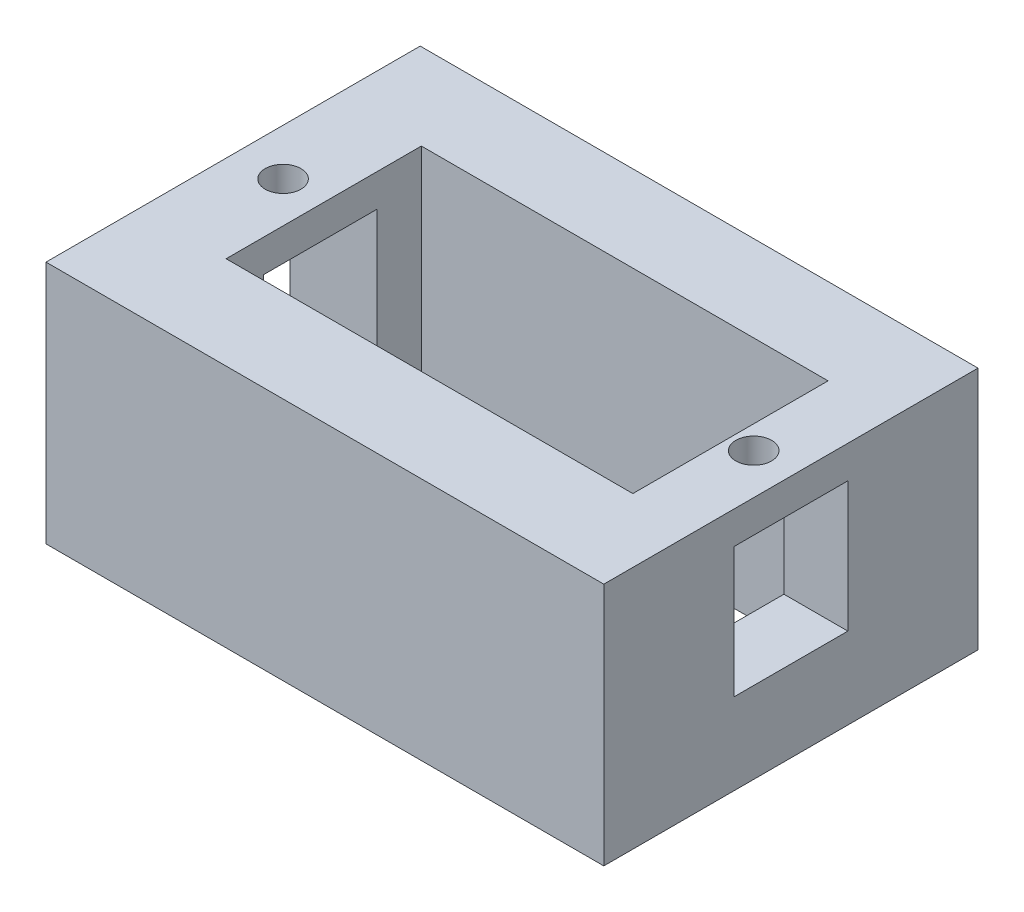
ISO-10303-21;
HEADER;
FILE_DESCRIPTION(('STEP AP214'),'2;1');
FILE_NAME('part.step','',(''),(''),'','','');
FILE_SCHEMA(('AUTOMOTIVE_DESIGN { 1 0 10303 214 1 1 1 1 }'));
ENDSEC;
DATA;
#1=APPLICATION_CONTEXT('core data for automotive mechanical design processes');
#2=APPLICATION_PROTOCOL_DEFINITION('international standard','automotive_design',2000,#1);
#3=PRODUCT_CONTEXT('',#1,'mechanical');
#4=PRODUCT('Part','Part','',(#3));
#5=PRODUCT_RELATED_PRODUCT_CATEGORY('part','',(#4));
#6=PRODUCT_DEFINITION_FORMATION('','',#4);
#7=PRODUCT_DEFINITION_CONTEXT('part definition',#1,'design');
#8=PRODUCT_DEFINITION('design','',#6,#7);
#9=PRODUCT_DEFINITION_SHAPE('','',#8);
#10=(LENGTH_UNIT() NAMED_UNIT(*) SI_UNIT(.MILLI.,.METRE.));
#11=(NAMED_UNIT(*) PLANE_ANGLE_UNIT() SI_UNIT($,.RADIAN.));
#12=(NAMED_UNIT(*) SI_UNIT($,.STERADIAN.) SOLID_ANGLE_UNIT());
#13=UNCERTAINTY_MEASURE_WITH_UNIT(LENGTH_MEASURE(1.E-05),#10,'distance_accuracy_value','');
#14=(GEOMETRIC_REPRESENTATION_CONTEXT(3) GLOBAL_UNCERTAINTY_ASSIGNED_CONTEXT((#13)) GLOBAL_UNIT_ASSIGNED_CONTEXT((#10,
#11,#12)) REPRESENTATION_CONTEXT('',''));
#15=CARTESIAN_POINT('',(0.,0.,0.));
#16=DIRECTION('',(0.,0.,1.));
#17=DIRECTION('',(1.,0.,0.));
#18=AXIS2_PLACEMENT_3D('',#15,#16,#17);
#19=CARTESIAN_POINT('',(-11.7142857142857,15.,-12.5357142857143));
#20=DIRECTION('',(1.,0.,0.));
#21=DIRECTION('',(0.,0.,-1.));
#22=AXIS2_PLACEMENT_3D('',#19,#20,#21);
#23=PLANE('',#22);
#24=DIRECTION('',(0.,0.,1.));
#25=VECTOR('',#24,1.);
#26=CARTESIAN_POINT('',(-11.7142857142857,0.,-12.5357142857143));
#27=LINE('',#26,#25);
#28=CARTESIAN_POINT('',(-11.7142857142857,0.,-12.5357142857143));
#29=VERTEX_POINT('',#28);
#30=CARTESIAN_POINT('',(-11.7142857142857,0.,10.4642857142857));
#31=VERTEX_POINT('',#30);
#32=EDGE_CURVE('E228',#29,#31,#27,.T.);
#33=ORIENTED_EDGE('',*,*,#32,.T.);
#34=DIRECTION('',(0.,-1.,0.));
#35=VECTOR('',#34,1.);
#36=CARTESIAN_POINT('',(-11.7142857142857,15.,10.4642857142857));
#37=LINE('',#36,#35);
#38=CARTESIAN_POINT('',(-11.7142857142857,15.,10.4642857142857));
#39=VERTEX_POINT('',#38);
#40=EDGE_CURVE('E255',#39,#31,#37,.T.);
#41=ORIENTED_EDGE('',*,*,#40,.F.);
#42=DIRECTION('',(0.,0.,1.));
#43=VECTOR('',#42,1.);
#44=CARTESIAN_POINT('',(-11.7142857142857,15.,-12.5357142857143));
#45=LINE('',#44,#43);
#46=CARTESIAN_POINT('',(-11.7142857142857,15.,-12.5357142857143));
#47=VERTEX_POINT('',#46);
#48=EDGE_CURVE('E229',#47,#39,#45,.T.);
#49=ORIENTED_EDGE('',*,*,#48,.F.);
#50=DIRECTION('',(0.,-1.,0.));
#51=VECTOR('',#50,1.);
#52=CARTESIAN_POINT('',(-11.7142857142857,15.,-12.5357142857143));
#53=LINE('',#52,#51);
#54=EDGE_CURVE('E239',#47,#29,#53,.T.);
#55=ORIENTED_EDGE('',*,*,#54,.T.);
#56=EDGE_LOOP('',(#33,#41,#49,#55));
#57=FACE_BOUND('',#56,.T.);
#58=DIRECTION('',(0.,1.,0.));
#59=VECTOR('',#58,1.);
#60=CARTESIAN_POINT('',(-11.7142857142857,0.,-4.53571428571429));
#61=LINE('',#60,#59);
#62=CARTESIAN_POINT('',(-11.7142857142857,5.,-4.53571428571429));
#63=VERTEX_POINT('',#62);
#64=CARTESIAN_POINT('',(-11.7142857142857,13.,-4.53571428571429));
#65=VERTEX_POINT('',#64);
#66=EDGE_CURVE('E49',#63,#65,#61,.T.);
#67=ORIENTED_EDGE('',*,*,#66,.T.);
#68=DIRECTION('',(0.,0.,-1.));
#69=VECTOR('',#68,1.);
#70=CARTESIAN_POINT('',(-11.7142857142857,13.,0.));
#71=LINE('',#70,#69);
#72=CARTESIAN_POINT('',(-11.7142857142857,13.,2.46428571428571));
#73=VERTEX_POINT('',#72);
#74=EDGE_CURVE('E168',#73,#65,#71,.T.);
#75=ORIENTED_EDGE('',*,*,#74,.F.);
#76=DIRECTION('',(0.,-1.,0.));
#77=VECTOR('',#76,1.);
#78=CARTESIAN_POINT('',(-11.7142857142857,0.,2.46428571428571));
#79=LINE('',#78,#77);
#80=CARTESIAN_POINT('',(-11.7142857142857,5.,2.46428571428571));
#81=VERTEX_POINT('',#80);
#82=EDGE_CURVE('E153',#73,#81,#79,.T.);
#83=ORIENTED_EDGE('',*,*,#82,.T.);
#84=DIRECTION('',(0.,0.,-1.));
#85=VECTOR('',#84,1.);
#86=CARTESIAN_POINT('',(-11.7142857142857,5.,0.));
#87=LINE('',#86,#85);
#88=EDGE_CURVE('E162',#81,#63,#87,.T.);
#89=ORIENTED_EDGE('',*,*,#88,.T.);
#90=EDGE_LOOP('',(#67,#75,#83,#89));
#91=FACE_BOUND('',#90,.T.);
#92=ADVANCED_FACE('F34',(#57,#91),#23,.F.);
#93=CARTESIAN_POINT('',(22.5714285714286,15.,-12.5357142857143));
#94=DIRECTION('',(-1.,0.,0.));
#95=DIRECTION('',(0.,0.,1.));
#96=AXIS2_PLACEMENT_3D('',#93,#94,#95);
#97=PLANE('',#96);
#98=DIRECTION('',(0.,0.,-1.));
#99=VECTOR('',#98,1.);
#100=CARTESIAN_POINT('',(22.5714285714286,0.,-12.5357142857143));
#101=LINE('',#100,#99);
#102=CARTESIAN_POINT('',(22.5714285714286,0.,10.4642857142857));
#103=VERTEX_POINT('',#102);
#104=CARTESIAN_POINT('',(22.5714285714286,0.,-12.5357142857143));
#105=VERTEX_POINT('',#104);
#106=EDGE_CURVE('E244',#103,#105,#101,.T.);
#107=ORIENTED_EDGE('',*,*,#106,.T.);
#108=DIRECTION('',(0.,-1.,0.));
#109=VECTOR('',#108,1.);
#110=CARTESIAN_POINT('',(22.5714285714286,15.,-12.5357142857143));
#111=LINE('',#110,#109);
#112=CARTESIAN_POINT('',(22.5714285714286,15.,-12.5357142857143));
#113=VERTEX_POINT('',#112);
#114=EDGE_CURVE('E249',#113,#105,#111,.T.);
#115=ORIENTED_EDGE('',*,*,#114,.F.);
#116=DIRECTION('',(0.,0.,-1.));
#117=VECTOR('',#116,1.);
#118=CARTESIAN_POINT('',(22.5714285714286,15.,-12.5357142857143));
#119=LINE('',#118,#117);
#120=CARTESIAN_POINT('',(22.5714285714286,15.,10.4642857142857));
#121=VERTEX_POINT('',#120);
#122=EDGE_CURVE('E235',#121,#113,#119,.T.);
#123=ORIENTED_EDGE('',*,*,#122,.F.);
#124=DIRECTION('',(0.,-1.,0.));
#125=VECTOR('',#124,1.);
#126=CARTESIAN_POINT('',(22.5714285714286,15.,10.4642857142857));
#127=LINE('',#126,#125);
#128=EDGE_CURVE('E252',#121,#103,#127,.T.);
#129=ORIENTED_EDGE('',*,*,#128,.T.);
#130=EDGE_LOOP('',(#107,#115,#123,#129));
#131=FACE_BOUND('',#130,.T.);
#132=DIRECTION('',(0.,1.,0.));
#133=VECTOR('',#132,1.);
#134=CARTESIAN_POINT('',(22.5714285714286,15.,-4.53571428571429));
#135=LINE('',#134,#133);
#136=CARTESIAN_POINT('',(22.5714285714286,5.,-4.53571428571429));
#137=VERTEX_POINT('',#136);
#138=CARTESIAN_POINT('',(22.5714285714286,13.,-4.53571428571429));
#139=VERTEX_POINT('',#138);
#140=EDGE_CURVE('E195',#137,#139,#135,.T.);
#141=ORIENTED_EDGE('',*,*,#140,.F.);
#142=DIRECTION('',(0.,0.,-1.));
#143=VECTOR('',#142,1.);
#144=CARTESIAN_POINT('',(22.5714285714286,5.,-12.5357142857143));
#145=LINE('',#144,#143);
#146=CARTESIAN_POINT('',(22.5714285714286,5.,2.46428571428571));
#147=VERTEX_POINT('',#146);
#148=EDGE_CURVE('E182',#147,#137,#145,.T.);
#149=ORIENTED_EDGE('',*,*,#148,.F.);
#150=DIRECTION('',(0.,-1.,0.));
#151=VECTOR('',#150,1.);
#152=CARTESIAN_POINT('',(22.5714285714286,15.,2.46428571428571));
#153=LINE('',#152,#151);
#154=CARTESIAN_POINT('',(22.5714285714286,13.,2.46428571428571));
#155=VERTEX_POINT('',#154);
#156=EDGE_CURVE('E185',#155,#147,#153,.T.);
#157=ORIENTED_EDGE('',*,*,#156,.F.);
#158=DIRECTION('',(0.,0.,-1.));
#159=VECTOR('',#158,1.);
#160=CARTESIAN_POINT('',(22.5714285714286,13.,-12.5357142857143));
#161=LINE('',#160,#159);
#162=EDGE_CURVE('E189',#155,#139,#161,.T.);
#163=ORIENTED_EDGE('',*,*,#162,.T.);
#164=EDGE_LOOP('',(#141,#149,#157,#163));
#165=FACE_BOUND('',#164,.T.);
#166=ADVANCED_FACE('F284',(#131,#165),#97,.F.);
#167=CARTESIAN_POINT('',(-6.35714285714286,15.,-7.25));
#168=DIRECTION('',(1.,0.,0.));
#169=DIRECTION('',(0.,0.,-1.));
#170=AXIS2_PLACEMENT_3D('',#167,#168,#169);
#171=PLANE('',#170);
#172=DIRECTION('',(0.,0.,1.));
#173=VECTOR('',#172,1.);
#174=CARTESIAN_POINT('',(-6.35714285714286,0.,-7.25));
#175=LINE('',#174,#173);
#176=CARTESIAN_POINT('',(-6.35714285714286,0.,-7.25));
#177=VERTEX_POINT('',#176);
#178=CARTESIAN_POINT('',(-6.35714285714286,0.,4.75));
#179=VERTEX_POINT('',#178);
#180=EDGE_CURVE('E197',#177,#179,#175,.T.);
#181=ORIENTED_EDGE('',*,*,#180,.F.);
#182=DIRECTION('',(0.,-1.,0.));
#183=VECTOR('',#182,1.);
#184=CARTESIAN_POINT('',(-6.35714285714286,15.,-7.25));
#185=LINE('',#184,#183);
#186=CARTESIAN_POINT('',(-6.35714285714286,15.,-7.25));
#187=VERTEX_POINT('',#186);
#188=EDGE_CURVE('E208',#187,#177,#185,.T.);
#189=ORIENTED_EDGE('',*,*,#188,.F.);
#190=DIRECTION('',(0.,0.,1.));
#191=VECTOR('',#190,1.);
#192=CARTESIAN_POINT('',(-6.35714285714286,15.,-7.25));
#193=LINE('',#192,#191);
#194=CARTESIAN_POINT('',(-6.35714285714286,15.,4.75));
#195=VERTEX_POINT('',#194);
#196=EDGE_CURVE('E198',#187,#195,#193,.T.);
#197=ORIENTED_EDGE('',*,*,#196,.T.);
#198=DIRECTION('',(0.,-1.,0.));
#199=VECTOR('',#198,1.);
#200=CARTESIAN_POINT('',(-6.35714285714286,15.,4.75));
#201=LINE('',#200,#199);
#202=EDGE_CURVE('E225',#195,#179,#201,.T.);
#203=ORIENTED_EDGE('',*,*,#202,.T.);
#204=EDGE_LOOP('',(#181,#189,#197,#203));
#205=FACE_BOUND('',#204,.T.);
#206=DIRECTION('',(0.,0.,1.));
#207=VECTOR('',#206,1.);
#208=CARTESIAN_POINT('',(-6.35714285714286,13.,-7.25));
#209=LINE('',#208,#207);
#210=CARTESIAN_POINT('',(-6.35714285714286,13.,-4.53571428571429));
#211=VERTEX_POINT('',#210);
#212=CARTESIAN_POINT('',(-6.35714285714285,13.,2.46428571428571));
#213=VERTEX_POINT('',#212);
#214=EDGE_CURVE('E187',#211,#213,#209,.T.);
#215=ORIENTED_EDGE('',*,*,#214,.F.);
#216=DIRECTION('',(0.,-1.,0.));
#217=VECTOR('',#216,1.);
#218=CARTESIAN_POINT('',(-6.35714285714286,15.,-4.53571428571429));
#219=LINE('',#218,#217);
#220=CARTESIAN_POINT('',(-6.35714285714286,5.,-4.53571428571429));
#221=VERTEX_POINT('',#220);
#222=EDGE_CURVE('E192',#211,#221,#219,.T.);
#223=ORIENTED_EDGE('',*,*,#222,.T.);
#224=DIRECTION('',(0.,0.,1.));
#225=VECTOR('',#224,1.);
#226=CARTESIAN_POINT('',(-6.35714285714286,5.,-7.25));
#227=LINE('',#226,#225);
#228=CARTESIAN_POINT('',(-6.35714285714286,5.,2.46428571428571));
#229=VERTEX_POINT('',#228);
#230=EDGE_CURVE('E180',#221,#229,#227,.T.);
#231=ORIENTED_EDGE('',*,*,#230,.T.);
#232=DIRECTION('',(0.,1.,0.));
#233=VECTOR('',#232,1.);
#234=CARTESIAN_POINT('',(-6.35714285714286,15.,2.46428571428571));
#235=LINE('',#234,#233);
#236=EDGE_CURVE('E156',#229,#213,#235,.T.);
#237=ORIENTED_EDGE('',*,*,#236,.T.);
#238=EDGE_LOOP('',(#215,#223,#231,#237));
#239=FACE_BOUND('',#238,.T.);
#240=ADVANCED_FACE('F286',(#205,#239),#171,.T.);
#241=CARTESIAN_POINT('',(18.6428571428571,15.,-7.25));
#242=DIRECTION('',(-1.,0.,0.));
#243=DIRECTION('',(0.,0.,1.));
#244=AXIS2_PLACEMENT_3D('',#241,#242,#243);
#245=PLANE('',#244);
#246=DIRECTION('',(0.,0.,-1.));
#247=VECTOR('',#246,1.);
#248=CARTESIAN_POINT('',(18.6428571428571,0.,-7.25));
#249=LINE('',#248,#247);
#250=CARTESIAN_POINT('',(18.6428571428571,0.,4.75));
#251=VERTEX_POINT('',#250);
#252=CARTESIAN_POINT('',(18.6428571428571,0.,-7.25));
#253=VERTEX_POINT('',#252);
#254=EDGE_CURVE('E214',#251,#253,#249,.T.);
#255=ORIENTED_EDGE('',*,*,#254,.F.);
#256=DIRECTION('',(0.,-1.,0.));
#257=VECTOR('',#256,1.);
#258=CARTESIAN_POINT('',(18.6428571428571,15.,4.75));
#259=LINE('',#258,#257);
#260=CARTESIAN_POINT('',(18.6428571428571,15.,4.75));
#261=VERTEX_POINT('',#260);
#262=EDGE_CURVE('E223',#261,#251,#259,.T.);
#263=ORIENTED_EDGE('',*,*,#262,.F.);
#264=DIRECTION('',(0.,0.,-1.));
#265=VECTOR('',#264,1.);
#266=CARTESIAN_POINT('',(18.6428571428571,15.,-7.25));
#267=LINE('',#266,#265);
#268=CARTESIAN_POINT('',(18.6428571428571,15.,-7.25));
#269=VERTEX_POINT('',#268);
#270=EDGE_CURVE('E203',#261,#269,#267,.T.);
#271=ORIENTED_EDGE('',*,*,#270,.T.);
#272=DIRECTION('',(0.,-1.,0.));
#273=VECTOR('',#272,1.);
#274=CARTESIAN_POINT('',(18.6428571428571,15.,-7.25));
#275=LINE('',#274,#273);
#276=EDGE_CURVE('E221',#269,#253,#275,.T.);
#277=ORIENTED_EDGE('',*,*,#276,.T.);
#278=EDGE_LOOP('',(#255,#263,#271,#277));
#279=FACE_BOUND('',#278,.T.);
#280=DIRECTION('',(0.,0.,-1.));
#281=VECTOR('',#280,1.);
#282=CARTESIAN_POINT('',(18.6428571428571,5.,-7.25));
#283=LINE('',#282,#281);
#284=CARTESIAN_POINT('',(18.6428571428571,5.,2.46428571428571));
#285=VERTEX_POINT('',#284);
#286=CARTESIAN_POINT('',(18.6428571428571,5.,-4.53571428571429));
#287=VERTEX_POINT('',#286);
#288=EDGE_CURVE('E258',#285,#287,#283,.T.);
#289=ORIENTED_EDGE('',*,*,#288,.T.);
#290=DIRECTION('',(0.,1.,0.));
#291=VECTOR('',#290,1.);
#292=CARTESIAN_POINT('',(18.6428571428571,15.,-4.53571428571429));
#293=LINE('',#292,#291);
#294=CARTESIAN_POINT('',(18.6428571428571,13.,-4.53571428571429));
#295=VERTEX_POINT('',#294);
#296=EDGE_CURVE('E12',#287,#295,#293,.T.);
#297=ORIENTED_EDGE('',*,*,#296,.T.);
#298=DIRECTION('',(0.,0.,-1.));
#299=VECTOR('',#298,1.);
#300=CARTESIAN_POINT('',(18.6428571428571,13.,-7.25));
#301=LINE('',#300,#299);
#302=CARTESIAN_POINT('',(18.6428571428571,13.,2.46428571428571));
#303=VERTEX_POINT('',#302);
#304=EDGE_CURVE('E42',#303,#295,#301,.T.);
#305=ORIENTED_EDGE('',*,*,#304,.F.);
#306=DIRECTION('',(0.,-1.,0.));
#307=VECTOR('',#306,1.);
#308=CARTESIAN_POINT('',(18.6428571428571,15.,2.46428571428571));
#309=LINE('',#308,#307);
#310=EDGE_CURVE('E261',#303,#285,#309,.T.);
#311=ORIENTED_EDGE('',*,*,#310,.T.);
#312=EDGE_LOOP('',(#289,#297,#305,#311));
#313=FACE_BOUND('',#312,.T.);
#314=ADVANCED_FACE('F277',(#279,#313),#245,.T.);
#315=CARTESIAN_POINT('',(0.,15.,0.));
#316=DIRECTION('',(0.,1.,0.));
#317=DIRECTION('',(0.,0.,1.));
#318=AXIS2_PLACEMENT_3D('',#315,#316,#317);
#319=PLANE('',#318);
#320=CARTESIAN_POINT('',(-8.85714285714286,15.,-1.25));
#321=DIRECTION('',(0.,1.,0.));
#322=DIRECTION('',(0.,0.,1.));
#323=AXIS2_PLACEMENT_3D('',#320,#321,#322);
#324=CIRCLE('',#323,1.1);
#325=CARTESIAN_POINT('',(-8.85714285714286,15.,-0.150000000000001));
#326=VERTEX_POINT('',#325);
#327=EDGE_CURVE('E493',#326,#326,#324,.T.);
#328=ORIENTED_EDGE('',*,*,#327,.F.);
#329=EDGE_LOOP('',(#328));
#330=FACE_BOUND('',#329,.T.);
#331=CARTESIAN_POINT('',(20.0714285714286,15.,-1.25));
#332=DIRECTION('',(0.,1.,0.));
#333=DIRECTION('',(0.,0.,1.));
#334=AXIS2_PLACEMENT_3D('',#331,#332,#333);
#335=CIRCLE('',#334,1.1);
#336=CARTESIAN_POINT('',(20.0714285714286,15.,-0.150000000000003));
#337=VERTEX_POINT('',#336);
#338=EDGE_CURVE('E488',#337,#337,#335,.T.);
#339=ORIENTED_EDGE('',*,*,#338,.F.);
#340=EDGE_LOOP('',(#339));
#341=FACE_BOUND('',#340,.T.);
#342=ORIENTED_EDGE('',*,*,#48,.T.);
#343=DIRECTION('',(1.,0.,0.));
#344=VECTOR('',#343,1.);
#345=CARTESIAN_POINT('',(-11.7142857142857,15.,10.4642857142857));
#346=LINE('',#345,#344);
#347=EDGE_CURVE('E232',#39,#121,#346,.T.);
#348=ORIENTED_EDGE('',*,*,#347,.T.);
#349=ORIENTED_EDGE('',*,*,#122,.T.);
#350=DIRECTION('',(-1.,0.,0.));
#351=VECTOR('',#350,1.);
#352=CARTESIAN_POINT('',(-11.7142857142857,15.,-12.5357142857143));
#353=LINE('',#352,#351);
#354=EDGE_CURVE('E237',#113,#47,#353,.T.);
#355=ORIENTED_EDGE('',*,*,#354,.T.);
#356=EDGE_LOOP('',(#342,#348,#349,#355));
#357=FACE_BOUND('',#356,.T.);
#358=DIRECTION('',(1.,0.,0.));
#359=VECTOR('',#358,1.);
#360=CARTESIAN_POINT('',(-6.35714285714286,15.,4.75));
#361=LINE('',#360,#359);
#362=EDGE_CURVE('E200',#195,#261,#361,.T.);
#363=ORIENTED_EDGE('',*,*,#362,.F.);
#364=ORIENTED_EDGE('',*,*,#196,.F.);
#365=DIRECTION('',(-1.,0.,0.));
#366=VECTOR('',#365,1.);
#367=CARTESIAN_POINT('',(-6.35714285714286,15.,-7.25));
#368=LINE('',#367,#366);
#369=EDGE_CURVE('E206',#269,#187,#368,.T.);
#370=ORIENTED_EDGE('',*,*,#369,.F.);
#371=ORIENTED_EDGE('',*,*,#270,.F.);
#372=EDGE_LOOP('',(#363,#364,#370,#371));
#373=FACE_BOUND('',#372,.T.);
#374=ADVANCED_FACE('F309',(#330,#341,#357,#373),#319,.T.);
#375=CARTESIAN_POINT('',(0.,0.,0.));
#376=DIRECTION('',(0.,1.,0.));
#377=DIRECTION('',(0.,0.,1.));
#378=AXIS2_PLACEMENT_3D('',#375,#376,#377);
#379=PLANE('',#378);
#380=ORIENTED_EDGE('',*,*,#32,.F.);
#381=DIRECTION('',(-1.,0.,0.));
#382=VECTOR('',#381,1.);
#383=CARTESIAN_POINT('',(-11.7142857142857,0.,-12.5357142857143));
#384=LINE('',#383,#382);
#385=EDGE_CURVE('E233',#105,#29,#384,.T.);
#386=ORIENTED_EDGE('',*,*,#385,.F.);
#387=ORIENTED_EDGE('',*,*,#106,.F.);
#388=DIRECTION('',(1.,0.,0.));
#389=VECTOR('',#388,1.);
#390=CARTESIAN_POINT('',(-11.7142857142857,0.,10.4642857142857));
#391=LINE('',#390,#389);
#392=EDGE_CURVE('E242',#31,#103,#391,.T.);
#393=ORIENTED_EDGE('',*,*,#392,.F.);
#394=EDGE_LOOP('',(#380,#386,#387,#393));
#395=FACE_BOUND('',#394,.T.);
#396=ORIENTED_EDGE('',*,*,#180,.T.);
#397=DIRECTION('',(1.,0.,0.));
#398=VECTOR('',#397,1.);
#399=CARTESIAN_POINT('',(-6.35714285714286,0.,4.75));
#400=LINE('',#399,#398);
#401=EDGE_CURVE('E211',#179,#251,#400,.T.);
#402=ORIENTED_EDGE('',*,*,#401,.T.);
#403=ORIENTED_EDGE('',*,*,#254,.T.);
#404=DIRECTION('',(-1.,0.,0.));
#405=VECTOR('',#404,1.);
#406=CARTESIAN_POINT('',(-6.35714285714286,0.,-7.25));
#407=LINE('',#406,#405);
#408=EDGE_CURVE('E201',#253,#177,#407,.T.);
#409=ORIENTED_EDGE('',*,*,#408,.T.);
#410=EDGE_LOOP('',(#396,#402,#403,#409));
#411=FACE_BOUND('',#410,.T.);
#412=ADVANCED_FACE('F301',(#395,#411),#379,.F.);
#413=CARTESIAN_POINT('',(-11.7142857142857,15.,10.4642857142857));
#414=DIRECTION('',(0.,0.,-1.));
#415=DIRECTION('',(-1.,0.,0.));
#416=AXIS2_PLACEMENT_3D('',#413,#414,#415);
#417=PLANE('',#416);
#418=ORIENTED_EDGE('',*,*,#392,.T.);
#419=ORIENTED_EDGE('',*,*,#128,.F.);
#420=ORIENTED_EDGE('',*,*,#347,.F.);
#421=ORIENTED_EDGE('',*,*,#40,.T.);
#422=EDGE_LOOP('',(#418,#419,#420,#421));
#423=FACE_BOUND('',#422,.T.);
#424=ADVANCED_FACE('F299',(#423),#417,.F.);
#425=CARTESIAN_POINT('',(-11.7142857142857,15.,-12.5357142857143));
#426=DIRECTION('',(0.,0.,1.));
#427=DIRECTION('',(1.,0.,0.));
#428=AXIS2_PLACEMENT_3D('',#425,#426,#427);
#429=PLANE('',#428);
#430=ORIENTED_EDGE('',*,*,#385,.T.);
#431=ORIENTED_EDGE('',*,*,#54,.F.);
#432=ORIENTED_EDGE('',*,*,#354,.F.);
#433=ORIENTED_EDGE('',*,*,#114,.T.);
#434=EDGE_LOOP('',(#430,#431,#432,#433));
#435=FACE_BOUND('',#434,.T.);
#436=ADVANCED_FACE('F297',(#435),#429,.F.);
#437=CARTESIAN_POINT('',(-6.35714285714286,15.,4.75));
#438=DIRECTION('',(0.,0.,-1.));
#439=DIRECTION('',(-1.,0.,0.));
#440=AXIS2_PLACEMENT_3D('',#437,#438,#439);
#441=PLANE('',#440);
#442=ORIENTED_EDGE('',*,*,#401,.F.);
#443=ORIENTED_EDGE('',*,*,#202,.F.);
#444=ORIENTED_EDGE('',*,*,#362,.T.);
#445=ORIENTED_EDGE('',*,*,#262,.T.);
#446=EDGE_LOOP('',(#442,#443,#444,#445));
#447=FACE_BOUND('',#446,.T.);
#448=ADVANCED_FACE('F307',(#447),#441,.T.);
#449=CARTESIAN_POINT('',(-6.35714285714286,15.,-7.25));
#450=DIRECTION('',(0.,0.,1.));
#451=DIRECTION('',(1.,0.,0.));
#452=AXIS2_PLACEMENT_3D('',#449,#450,#451);
#453=PLANE('',#452);
#454=ORIENTED_EDGE('',*,*,#408,.F.);
#455=ORIENTED_EDGE('',*,*,#276,.F.);
#456=ORIENTED_EDGE('',*,*,#369,.T.);
#457=ORIENTED_EDGE('',*,*,#188,.T.);
#458=EDGE_LOOP('',(#454,#455,#456,#457));
#459=FACE_BOUND('',#458,.T.);
#460=ADVANCED_FACE('F340',(#459),#453,.T.);
#461=CARTESIAN_POINT('',(48.2857142857143,5.,0.));
#462=DIRECTION('',(0.,1.,0.));
#463=DIRECTION('',(0.,0.,1.));
#464=AXIS2_PLACEMENT_3D('',#461,#462,#463);
#465=PLANE('',#464);
#466=ORIENTED_EDGE('',*,*,#148,.T.);
#467=DIRECTION('',(-1.,0.,0.));
#468=VECTOR('',#467,1.);
#469=CARTESIAN_POINT('',(48.2857142857143,5.,-4.53571428571429));
#470=LINE('',#469,#468);
#471=EDGE_CURVE('E159',#137,#287,#470,.T.);
#472=ORIENTED_EDGE('',*,*,#471,.T.);
#473=ORIENTED_EDGE('',*,*,#288,.F.);
#474=DIRECTION('',(-1.,0.,0.));
#475=VECTOR('',#474,1.);
#476=CARTESIAN_POINT('',(48.2857142857143,5.,2.46428571428571));
#477=LINE('',#476,#475);
#478=EDGE_CURVE('E57',#147,#285,#477,.T.);
#479=ORIENTED_EDGE('',*,*,#478,.F.);
#480=EDGE_LOOP('',(#466,#472,#473,#479));
#481=FACE_BOUND('',#480,.T.);
#482=ADVANCED_FACE('F278',(#481),#465,.T.);
#483=CARTESIAN_POINT('',(48.2857142857143,0.,2.46428571428571));
#484=DIRECTION('',(0.,0.,-1.));
#485=DIRECTION('',(0.,1.,0.));
#486=AXIS2_PLACEMENT_3D('',#483,#484,#485);
#487=PLANE('',#486);
#488=ORIENTED_EDGE('',*,*,#156,.T.);
#489=ORIENTED_EDGE('',*,*,#478,.T.);
#490=ORIENTED_EDGE('',*,*,#310,.F.);
#491=DIRECTION('',(-1.,0.,0.));
#492=VECTOR('',#491,1.);
#493=CARTESIAN_POINT('',(48.2857142857143,13.,2.46428571428571));
#494=LINE('',#493,#492);
#495=EDGE_CURVE('E176',#155,#303,#494,.T.);
#496=ORIENTED_EDGE('',*,*,#495,.F.);
#497=EDGE_LOOP('',(#488,#489,#490,#496));
#498=FACE_BOUND('',#497,.T.);
#499=ADVANCED_FACE('F280',(#498),#487,.T.);
#500=CARTESIAN_POINT('',(48.2857142857143,13.,0.));
#501=DIRECTION('',(0.,1.,0.));
#502=DIRECTION('',(0.,0.,1.));
#503=AXIS2_PLACEMENT_3D('',#500,#501,#502);
#504=PLANE('',#503);
#505=CARTESIAN_POINT('',(20.0714285714286,13.,-1.25));
#506=DIRECTION('',(0.,1.,0.));
#507=DIRECTION('',(0.,0.,1.));
#508=AXIS2_PLACEMENT_3D('',#505,#506,#507);
#509=CIRCLE('',#508,1.1);
#510=CARTESIAN_POINT('',(20.0714285714286,13.,-0.150000000000003));
#511=VERTEX_POINT('',#510);
#512=EDGE_CURVE('E37',#511,#511,#509,.T.);
#513=ORIENTED_EDGE('',*,*,#512,.T.);
#514=EDGE_LOOP('',(#513));
#515=FACE_BOUND('',#514,.T.);
#516=ORIENTED_EDGE('',*,*,#495,.T.);
#517=ORIENTED_EDGE('',*,*,#304,.T.);
#518=DIRECTION('',(-1.,0.,0.));
#519=VECTOR('',#518,1.);
#520=CARTESIAN_POINT('',(48.2857142857143,13.,-4.53571428571429));
#521=LINE('',#520,#519);
#522=EDGE_CURVE('E175',#139,#295,#521,.T.);
#523=ORIENTED_EDGE('',*,*,#522,.F.);
#524=ORIENTED_EDGE('',*,*,#162,.F.);
#525=EDGE_LOOP('',(#516,#517,#523,#524));
#526=FACE_BOUND('',#525,.T.);
#527=ADVANCED_FACE('F269',(#515,#526),#504,.F.);
#528=CARTESIAN_POINT('',(48.2857142857143,0.,-4.53571428571429));
#529=DIRECTION('',(0.,0.,1.));
#530=DIRECTION('',(1.,0.,0.));
#531=AXIS2_PLACEMENT_3D('',#528,#529,#530);
#532=PLANE('',#531);
#533=ORIENTED_EDGE('',*,*,#140,.T.);
#534=ORIENTED_EDGE('',*,*,#522,.T.);
#535=ORIENTED_EDGE('',*,*,#296,.F.);
#536=ORIENTED_EDGE('',*,*,#471,.F.);
#537=EDGE_LOOP('',(#533,#534,#535,#536));
#538=FACE_BOUND('',#537,.T.);
#539=ADVANCED_FACE('F274',(#538),#532,.T.);
#540=EDGE_CURVE('E173',#211,#65,#521,.T.);
#541=ORIENTED_EDGE('',*,*,#540,.T.);
#542=ORIENTED_EDGE('',*,*,#66,.F.);
#543=EDGE_CURVE('E164',#221,#63,#470,.T.);
#544=ORIENTED_EDGE('',*,*,#543,.F.);
#545=ORIENTED_EDGE('',*,*,#222,.F.);
#546=EDGE_LOOP('',(#541,#542,#544,#545));
#547=FACE_BOUND('',#546,.T.);
#548=ADVANCED_FACE('F433',(#547),#532,.T.);
#549=CARTESIAN_POINT('',(-8.85714285714286,13.,-1.25));
#550=DIRECTION('',(0.,1.,0.));
#551=DIRECTION('',(0.,0.,1.));
#552=AXIS2_PLACEMENT_3D('',#549,#550,#551);
#553=CIRCLE('',#552,1.1);
#554=CARTESIAN_POINT('',(-8.85714285714286,13.,-0.150000000000001));
#555=VERTEX_POINT('',#554);
#556=EDGE_CURVE('E491',#555,#555,#553,.T.);
#557=ORIENTED_EDGE('',*,*,#556,.T.);
#558=EDGE_LOOP('',(#557));
#559=FACE_BOUND('',#558,.T.);
#560=ORIENTED_EDGE('',*,*,#214,.T.);
#561=EDGE_CURVE('E177',#213,#73,#494,.T.);
#562=ORIENTED_EDGE('',*,*,#561,.T.);
#563=ORIENTED_EDGE('',*,*,#74,.T.);
#564=ORIENTED_EDGE('',*,*,#540,.F.);
#565=EDGE_LOOP('',(#560,#562,#563,#564));
#566=FACE_BOUND('',#565,.T.);
#567=ADVANCED_FACE('F426',(#559,#566),#504,.F.);
#568=EDGE_CURVE('E148',#229,#81,#477,.T.);
#569=ORIENTED_EDGE('',*,*,#568,.T.);
#570=ORIENTED_EDGE('',*,*,#82,.F.);
#571=ORIENTED_EDGE('',*,*,#561,.F.);
#572=ORIENTED_EDGE('',*,*,#236,.F.);
#573=EDGE_LOOP('',(#569,#570,#571,#572));
#574=FACE_BOUND('',#573,.T.);
#575=ADVANCED_FACE('F150',(#574),#487,.T.);
#576=ORIENTED_EDGE('',*,*,#543,.T.);
#577=ORIENTED_EDGE('',*,*,#88,.F.);
#578=ORIENTED_EDGE('',*,*,#568,.F.);
#579=ORIENTED_EDGE('',*,*,#230,.F.);
#580=EDGE_LOOP('',(#576,#577,#578,#579));
#581=FACE_BOUND('',#580,.T.);
#582=ADVANCED_FACE('F163',(#581),#465,.T.);
#583=CARTESIAN_POINT('',(-8.85714285714286,5.,-1.25));
#584=DIRECTION('',(0.,1.,0.));
#585=DIRECTION('',(0.,0.,1.));
#586=AXIS2_PLACEMENT_3D('',#583,#584,#585);
#587=CYLINDRICAL_SURFACE('',#586,1.1);
#588=ORIENTED_EDGE('',*,*,#327,.T.);
#589=EDGE_LOOP('',(#588));
#590=FACE_BOUND('',#589,.T.);
#591=ORIENTED_EDGE('',*,*,#556,.F.);
#592=EDGE_LOOP('',(#591));
#593=FACE_BOUND('',#592,.T.);
#594=ADVANCED_FACE('F457',(#590,#593),#587,.F.);
#595=CARTESIAN_POINT('',(20.0714285714286,5.,-1.25));
#596=DIRECTION('',(0.,1.,0.));
#597=DIRECTION('',(0.,0.,1.));
#598=AXIS2_PLACEMENT_3D('',#595,#596,#597);
#599=CYLINDRICAL_SURFACE('',#598,1.1);
#600=ORIENTED_EDGE('',*,*,#338,.T.);
#601=EDGE_LOOP('',(#600));
#602=FACE_BOUND('',#601,.T.);
#603=ORIENTED_EDGE('',*,*,#512,.F.);
#604=EDGE_LOOP('',(#603));
#605=FACE_BOUND('',#604,.T.);
#606=ADVANCED_FACE('F464',(#602,#605),#599,.F.);
#607=CLOSED_SHELL('',(#92,#166,#240,#314,#374,#412,#424,#436,#448,#460,#482,#499,#527,#539,#548,
#567,#575,#582,#594,#606));
#608=MANIFOLD_SOLID_BREP('B2',#607);
#609=ADVANCED_BREP_SHAPE_REPRESENTATION('',(#18,#608),#14);
#610=SHAPE_DEFINITION_REPRESENTATION(#9,#609);
ENDSEC;
END-ISO-10303-21;
